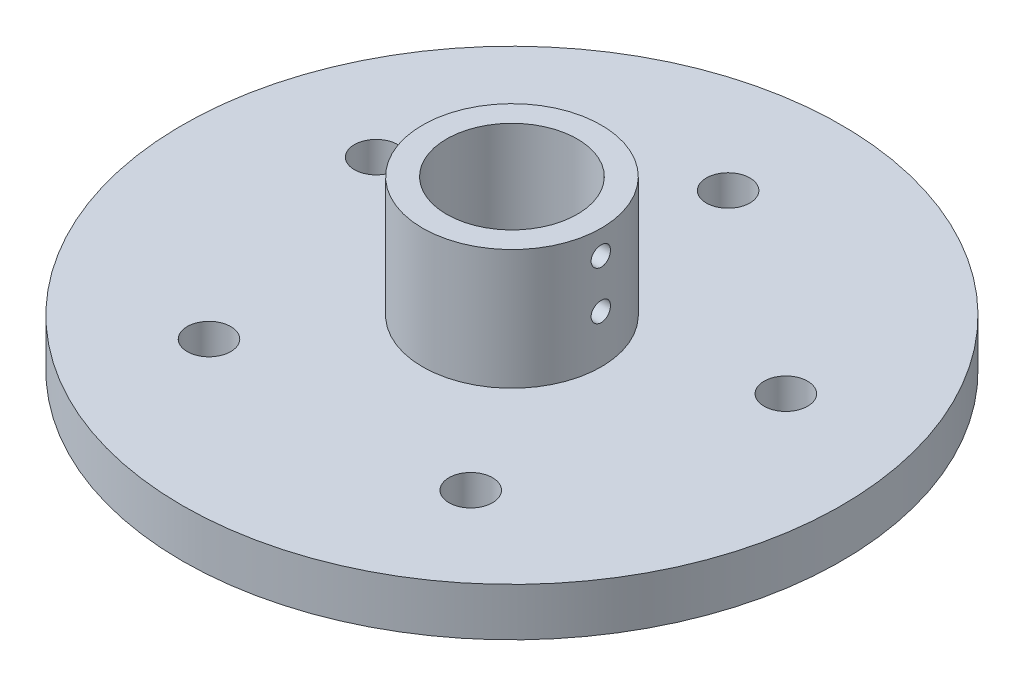
ISO-10303-21;
HEADER;
FILE_DESCRIPTION(('STEP AP214'),'2;1');
FILE_NAME('part.step','',(''),(''),'','','');
FILE_SCHEMA(('AUTOMOTIVE_DESIGN { 1 0 10303 214 1 1 1 1 }'));
ENDSEC;
DATA;
#1=APPLICATION_CONTEXT('core data for automotive mechanical design processes');
#2=APPLICATION_PROTOCOL_DEFINITION('international standard','automotive_design',2000,#1);
#3=PRODUCT_CONTEXT('',#1,'mechanical');
#4=PRODUCT('Part','Part','',(#3));
#5=PRODUCT_RELATED_PRODUCT_CATEGORY('part','',(#4));
#6=PRODUCT_DEFINITION_FORMATION('','',#4);
#7=PRODUCT_DEFINITION_CONTEXT('part definition',#1,'design');
#8=PRODUCT_DEFINITION('design','',#6,#7);
#9=PRODUCT_DEFINITION_SHAPE('','',#8);
#10=(LENGTH_UNIT() NAMED_UNIT(*) SI_UNIT(.MILLI.,.METRE.));
#11=(NAMED_UNIT(*) PLANE_ANGLE_UNIT() SI_UNIT($,.RADIAN.));
#12=(NAMED_UNIT(*) SI_UNIT($,.STERADIAN.) SOLID_ANGLE_UNIT());
#13=UNCERTAINTY_MEASURE_WITH_UNIT(LENGTH_MEASURE(1.E-05),#10,'distance_accuracy_value','');
#14=(GEOMETRIC_REPRESENTATION_CONTEXT(3) GLOBAL_UNCERTAINTY_ASSIGNED_CONTEXT((#13)) GLOBAL_UNIT_ASSIGNED_CONTEXT((#10,
#11,#12)) REPRESENTATION_CONTEXT('',''));
#15=CARTESIAN_POINT('',(0.,0.,0.));
#16=DIRECTION('',(0.,0.,1.));
#17=DIRECTION('',(1.,0.,0.));
#18=AXIS2_PLACEMENT_3D('',#15,#16,#17);
#19=CARTESIAN_POINT('',(0.,12.7,0.));
#20=DIRECTION('',(0.,1.,0.));
#21=DIRECTION('',(0.,0.,1.));
#22=AXIS2_PLACEMENT_3D('',#19,#20,#21);
#23=PLANE('',#22);
#24=CARTESIAN_POINT('',(-54.1556260783448,12.7,-18.25625));
#25=DIRECTION('',(0.,1.,0.));
#26=DIRECTION('',(0.,0.,1.));
#27=AXIS2_PLACEMENT_3D('',#24,#25,#26);
#28=CIRCLE('',#27,5.75437);
#29=CARTESIAN_POINT('',(-54.1556260783448,12.7,-12.50188));
#30=VERTEX_POINT('',#29);
#31=EDGE_CURVE('E102',#30,#30,#28,.T.);
#32=ORIENTED_EDGE('',*,*,#31,.F.);
#33=EDGE_LOOP('',(#32));
#34=FACE_BOUND('',#33,.T.);
#35=CARTESIAN_POINT('',(0.,12.7,-57.15));
#36=DIRECTION('',(0.,1.,0.));
#37=DIRECTION('',(0.,0.,1.));
#38=AXIS2_PLACEMENT_3D('',#35,#36,#37);
#39=CIRCLE('',#38,5.75437);
#40=CARTESIAN_POINT('',(0.,12.7,-51.39563));
#41=VERTEX_POINT('',#40);
#42=EDGE_CURVE('E161',#41,#41,#39,.T.);
#43=ORIENTED_EDGE('',*,*,#42,.F.);
#44=EDGE_LOOP('',(#43));
#45=FACE_BOUND('',#44,.T.);
#46=CARTESIAN_POINT('',(54.1556260783448,12.7,-18.25625));
#47=DIRECTION('',(0.,1.,0.));
#48=DIRECTION('',(0.,0.,1.));
#49=AXIS2_PLACEMENT_3D('',#46,#47,#48);
#50=CIRCLE('',#49,5.75437);
#51=CARTESIAN_POINT('',(54.1556260783448,12.7,-12.50188));
#52=VERTEX_POINT('',#51);
#53=EDGE_CURVE('E168',#52,#52,#50,.T.);
#54=ORIENTED_EDGE('',*,*,#53,.F.);
#55=EDGE_LOOP('',(#54));
#56=FACE_BOUND('',#55,.T.);
#57=CARTESIAN_POINT('',(34.5994277722758,12.7,45.4862847222222));
#58=DIRECTION('',(0.,1.,0.));
#59=DIRECTION('',(0.,0.,1.));
#60=AXIS2_PLACEMENT_3D('',#57,#58,#59);
#61=CIRCLE('',#60,5.75437);
#62=CARTESIAN_POINT('',(34.5994277722758,12.7,51.2406547222222));
#63=VERTEX_POINT('',#62);
#64=EDGE_CURVE('E185',#63,#63,#61,.T.);
#65=ORIENTED_EDGE('',*,*,#64,.F.);
#66=EDGE_LOOP('',(#65));
#67=FACE_BOUND('',#66,.T.);
#68=CARTESIAN_POINT('',(-34.5994277722758,12.7,45.4862847222222));
#69=DIRECTION('',(0.,1.,0.));
#70=DIRECTION('',(0.,0.,1.));
#71=AXIS2_PLACEMENT_3D('',#68,#69,#70);
#72=CIRCLE('',#71,5.75437);
#73=CARTESIAN_POINT('',(-34.5994277722758,12.7,51.2406547222222));
#74=VERTEX_POINT('',#73);
#75=EDGE_CURVE('E192',#74,#74,#72,.T.);
#76=ORIENTED_EDGE('',*,*,#75,.F.);
#77=EDGE_LOOP('',(#76));
#78=FACE_BOUND('',#77,.T.);
#79=CARTESIAN_POINT('',(0.,12.7,0.));
#80=DIRECTION('',(0.,1.,0.));
#81=DIRECTION('',(0.,0.,1.));
#82=AXIS2_PLACEMENT_3D('',#79,#80,#81);
#83=CIRCLE('',#82,87.122);
#84=CARTESIAN_POINT('',(0.,12.7,87.122));
#85=VERTEX_POINT('',#84);
#86=EDGE_CURVE('E73',#85,#85,#83,.T.);
#87=ORIENTED_EDGE('',*,*,#86,.T.);
#88=EDGE_LOOP('',(#87));
#89=FACE_BOUND('',#88,.T.);
#90=CARTESIAN_POINT('',(0.,12.7,0.));
#91=DIRECTION('',(0.,1.,0.));
#92=DIRECTION('',(0.,0.,1.));
#93=AXIS2_PLACEMENT_3D('',#90,#91,#92);
#94=CIRCLE('',#93,23.622);
#95=CARTESIAN_POINT('',(0.,12.7,23.622));
#96=VERTEX_POINT('',#95);
#97=EDGE_CURVE('E206',#96,#96,#94,.T.);
#98=ORIENTED_EDGE('',*,*,#97,.F.);
#99=EDGE_LOOP('',(#98));
#100=FACE_BOUND('',#99,.T.);
#101=ADVANCED_FACE('F52',(#34,#45,#56,#67,#78,#89,#100),#23,.T.);
#102=CARTESIAN_POINT('',(0.,7.80947580645162,0.));
#103=DIRECTION('',(0.,1.,0.));
#104=DIRECTION('',(0.,0.,1.));
#105=AXIS2_PLACEMENT_3D('',#102,#103,#104);
#106=CYLINDRICAL_SURFACE('',#105,87.122);
#107=ORIENTED_EDGE('',*,*,#86,.F.);
#108=EDGE_LOOP('',(#107));
#109=FACE_BOUND('',#108,.T.);
#110=CARTESIAN_POINT('',(0.,0.,0.));
#111=DIRECTION('',(0.,1.,0.));
#112=DIRECTION('',(0.,0.,1.));
#113=AXIS2_PLACEMENT_3D('',#110,#111,#112);
#114=CIRCLE('',#113,87.122);
#115=CARTESIAN_POINT('',(0.,0.,87.122));
#116=VERTEX_POINT('',#115);
#117=EDGE_CURVE('E66',#116,#116,#114,.T.);
#118=ORIENTED_EDGE('',*,*,#117,.T.);
#119=EDGE_LOOP('',(#118));
#120=FACE_BOUND('',#119,.T.);
#121=ADVANCED_FACE('F118',(#109,#120),#106,.T.);
#122=CARTESIAN_POINT('',(0.,0.,0.));
#123=DIRECTION('',(0.,1.,0.));
#124=DIRECTION('',(0.,0.,1.));
#125=AXIS2_PLACEMENT_3D('',#122,#123,#124);
#126=PLANE('',#125);
#127=CARTESIAN_POINT('',(-54.1556260783448,0.,-18.25625));
#128=DIRECTION('',(0.,1.,0.));
#129=DIRECTION('',(0.,0.,1.));
#130=AXIS2_PLACEMENT_3D('',#127,#128,#129);
#131=CIRCLE('',#130,5.75436999999999);
#132=CARTESIAN_POINT('',(-54.1556260783448,0.,-12.50188));
#133=VERTEX_POINT('',#132);
#134=EDGE_CURVE('E164',#133,#133,#131,.T.);
#135=ORIENTED_EDGE('',*,*,#134,.T.);
#136=EDGE_LOOP('',(#135));
#137=FACE_BOUND('',#136,.T.);
#138=CARTESIAN_POINT('',(0.,0.,-57.15));
#139=DIRECTION('',(0.,1.,0.));
#140=DIRECTION('',(0.,0.,1.));
#141=AXIS2_PLACEMENT_3D('',#138,#139,#140);
#142=CIRCLE('',#141,5.75437);
#143=CARTESIAN_POINT('',(0.,0.,-51.39563));
#144=VERTEX_POINT('',#143);
#145=EDGE_CURVE('E158',#144,#144,#142,.T.);
#146=ORIENTED_EDGE('',*,*,#145,.T.);
#147=EDGE_LOOP('',(#146));
#148=FACE_BOUND('',#147,.T.);
#149=CARTESIAN_POINT('',(54.1556260783448,0.,-18.25625));
#150=DIRECTION('',(0.,1.,0.));
#151=DIRECTION('',(0.,0.,1.));
#152=AXIS2_PLACEMENT_3D('',#149,#150,#151);
#153=CIRCLE('',#152,5.75436999999999);
#154=CARTESIAN_POINT('',(54.1556260783448,0.,-12.50188));
#155=VERTEX_POINT('',#154);
#156=EDGE_CURVE('E181',#155,#155,#153,.T.);
#157=ORIENTED_EDGE('',*,*,#156,.T.);
#158=EDGE_LOOP('',(#157));
#159=FACE_BOUND('',#158,.T.);
#160=CARTESIAN_POINT('',(34.5994277722758,0.,45.4862847222222));
#161=DIRECTION('',(0.,1.,0.));
#162=DIRECTION('',(0.,0.,1.));
#163=AXIS2_PLACEMENT_3D('',#160,#161,#162);
#164=CIRCLE('',#163,5.75436999999999);
#165=CARTESIAN_POINT('',(34.5994277722758,0.,51.2406547222222));
#166=VERTEX_POINT('',#165);
#167=EDGE_CURVE('E187',#166,#166,#164,.T.);
#168=ORIENTED_EDGE('',*,*,#167,.T.);
#169=EDGE_LOOP('',(#168));
#170=FACE_BOUND('',#169,.T.);
#171=CARTESIAN_POINT('',(-34.5994277722758,0.,45.4862847222222));
#172=DIRECTION('',(0.,1.,0.));
#173=DIRECTION('',(0.,0.,1.));
#174=AXIS2_PLACEMENT_3D('',#171,#172,#173);
#175=CIRCLE('',#174,5.75436999999999);
#176=CARTESIAN_POINT('',(-34.5994277722758,0.,51.2406547222222));
#177=VERTEX_POINT('',#176);
#178=EDGE_CURVE('E195',#177,#177,#175,.T.);
#179=ORIENTED_EDGE('',*,*,#178,.T.);
#180=EDGE_LOOP('',(#179));
#181=FACE_BOUND('',#180,.T.);
#182=ORIENTED_EDGE('',*,*,#117,.F.);
#183=EDGE_LOOP('',(#182));
#184=FACE_BOUND('',#183,.T.);
#185=CARTESIAN_POINT('',(0.,0.,0.));
#186=DIRECTION('',(0.,1.,0.));
#187=DIRECTION('',(0.,0.,1.));
#188=AXIS2_PLACEMENT_3D('',#185,#186,#187);
#189=CIRCLE('',#188,17.272);
#190=CARTESIAN_POINT('',(0.,0.,17.272));
#191=VERTEX_POINT('',#190);
#192=EDGE_CURVE('E11',#191,#191,#189,.T.);
#193=ORIENTED_EDGE('',*,*,#192,.T.);
#194=EDGE_LOOP('',(#193));
#195=FACE_BOUND('',#194,.T.);
#196=ADVANCED_FACE('F121',(#137,#148,#159,#170,#181,#184,#195),#126,.F.);
#197=CARTESIAN_POINT('',(0.,44.45,0.));
#198=DIRECTION('',(0.,1.,0.));
#199=DIRECTION('',(0.,0.,1.));
#200=AXIS2_PLACEMENT_3D('',#197,#198,#199);
#201=PLANE('',#200);
#202=CARTESIAN_POINT('',(0.,44.45,0.));
#203=DIRECTION('',(0.,1.,0.));
#204=DIRECTION('',(0.,0.,1.));
#205=AXIS2_PLACEMENT_3D('',#202,#203,#204);
#206=CIRCLE('',#205,23.622);
#207=CARTESIAN_POINT('',(0.,44.45,23.622));
#208=VERTEX_POINT('',#207);
#209=EDGE_CURVE('E203',#208,#208,#206,.T.);
#210=ORIENTED_EDGE('',*,*,#209,.T.);
#211=EDGE_LOOP('',(#210));
#212=FACE_BOUND('',#211,.T.);
#213=CARTESIAN_POINT('',(0.,44.45,0.));
#214=DIRECTION('',(0.,1.,0.));
#215=DIRECTION('',(0.,0.,1.));
#216=AXIS2_PLACEMENT_3D('',#213,#214,#215);
#217=CIRCLE('',#216,17.272);
#218=CARTESIAN_POINT('',(0.,44.45,17.272));
#219=VERTEX_POINT('',#218);
#220=EDGE_CURVE('E200',#219,#219,#217,.T.);
#221=ORIENTED_EDGE('',*,*,#220,.F.);
#222=EDGE_LOOP('',(#221));
#223=FACE_BOUND('',#222,.T.);
#224=ADVANCED_FACE('F112',(#212,#223),#201,.T.);
#225=CARTESIAN_POINT('',(0.,7.80947580645162,0.));
#226=DIRECTION('',(0.,1.,0.));
#227=DIRECTION('',(0.,0.,1.));
#228=AXIS2_PLACEMENT_3D('',#225,#226,#227);
#229=CYLINDRICAL_SURFACE('',#228,23.622);
#230=CARTESIAN_POINT('',(23.4836668071662,38.1,2.55269999999999));
#231=CARTESIAN_POINT('',(23.4836686081218,38.2429364135109,2.55269384011101));
#232=CARTESIAN_POINT('',(23.4849858802919,38.3859657957874,2.540654126633));
#233=CARTESIAN_POINT('',(23.4901115382062,38.6680545531481,2.49280973768584));
#234=CARTESIAN_POINT('',(23.4939226267569,38.8071094498179,2.45697927710405));
#235=CARTESIAN_POINT('',(23.5035993053341,39.077123585863,2.36261284870633));
#236=CARTESIAN_POINT('',(23.5094636052178,39.2080878483649,2.30409113654485));
#237=CARTESIAN_POINT('',(23.5225843723355,39.4583083304028,2.16603179783894));
#238=CARTESIAN_POINT('',(23.5298405745369,39.577566772322,2.08649817109179));
#239=CARTESIAN_POINT('',(23.5449618611822,39.8015208112132,1.9083124095274));
#240=CARTESIAN_POINT('',(23.5528291321937,39.9061599726728,1.80958952169591));
#241=CARTESIAN_POINT('',(23.5682663281105,40.0974186744241,1.5959792465784));
#242=CARTESIAN_POINT('',(23.5758362390508,40.184037369236,1.48109110127853));
#243=CARTESIAN_POINT('',(23.5898476712134,40.3369939918702,1.23806267414504));
#244=CARTESIAN_POINT('',(23.5962863749723,40.4032815791767,1.10989053286984));
#245=CARTESIAN_POINT('',(23.6072860476201,40.5133721721303,0.844153107984615));
#246=CARTESIAN_POINT('',(23.6118470693922,40.5571758110268,0.706588089044095));
#247=CARTESIAN_POINT('',(23.618562107544,40.6208884833524,0.426542689068769));
#248=CARTESIAN_POINT('',(23.6207255011527,40.6408906282674,0.28408372010064));
#249=CARTESIAN_POINT('',(23.6224334616832,40.6567207680119,-0.00218442497647582));
#250=CARTESIAN_POINT('',(23.6219781070125,40.6525494866137,-0.145993560531656));
#251=CARTESIAN_POINT('',(23.6185075248789,40.6202264750132,-0.430247318832561));
#252=CARTESIAN_POINT('',(23.6155029859548,40.5921748715653,-0.570703475939404));
#253=CARTESIAN_POINT('',(23.6072838389455,40.5130436421409,-0.844902575482428));
#254=CARTESIAN_POINT('',(23.6020691980714,40.4619636745171,-0.978645418287599));
#255=CARTESIAN_POINT('',(23.5899975944878,40.3381168959008,-1.23593535300113));
#256=CARTESIAN_POINT('',(23.5831373041593,40.265306069786,-1.35946109572668));
#257=CARTESIAN_POINT('',(23.5685435187522,40.1000963808536,-1.59257745149923));
#258=CARTESIAN_POINT('',(23.5608099937467,40.0076968466079,-1.70216758667929));
#259=CARTESIAN_POINT('',(23.5452902509772,39.8053701941459,-1.90488886464143));
#260=CARTESIAN_POINT('',(23.5375039658879,39.6953559251848,-1.99793304295514));
#261=CARTESIAN_POINT('',(23.5227955644744,39.4612240295925,-2.16424717070808));
#262=CARTESIAN_POINT('',(23.5158734497749,39.3371063764461,-2.23751708296947));
#263=CARTESIAN_POINT('',(23.5036767608849,39.0782209498679,-2.36220399533878));
#264=CARTESIAN_POINT('',(23.4984026276002,38.9434503383762,-2.41361514861577));
#265=CARTESIAN_POINT('',(23.4901080428948,38.6671198150243,-2.49305388469559));
#266=CARTESIAN_POINT('',(23.487087511003,38.525560145779,-2.52108230245021));
#267=CARTESIAN_POINT('',(23.48365632423,38.2404346937009,-2.55284709431941));
#268=CARTESIAN_POINT('',(23.4832325752727,38.0968826401844,-2.55670534681208));
#269=CARTESIAN_POINT('',(23.485008359159,37.8111762779908,-2.54034081393235));
#270=CARTESIAN_POINT('',(23.4872078504864,37.6690219472288,-2.52011840966661));
#271=CARTESIAN_POINT('',(23.4939703671203,37.3905044989211,-2.45626876903324));
#272=CARTESIAN_POINT('',(23.498527530066,37.2541279207474,-2.41269957499601));
#273=CARTESIAN_POINT('',(23.5094871631114,36.9906179962903,-2.30345252508868));
#274=CARTESIAN_POINT('',(23.5158896823109,36.8634848960628,-2.23777408094507));
#275=CARTESIAN_POINT('',(23.5298502314998,36.6215164665234,-2.08586927615529));
#276=CARTESIAN_POINT('',(23.5374127465008,36.5067319455461,-1.99956240184101));
#277=CARTESIAN_POINT('',(23.5528266933129,36.2932351654284,-1.80896559642935));
#278=CARTESIAN_POINT('',(23.5606781334819,36.1945233716883,-1.70467514478139));
#279=CARTESIAN_POINT('',(23.5758250170651,36.0155514713621,-1.48054176424411));
#280=CARTESIAN_POINT('',(23.5831179724798,35.9353710467982,-1.36063501701851));
#281=CARTESIAN_POINT('',(23.5962896701766,35.7962871282659,-1.10898651179103));
#282=CARTESIAN_POINT('',(23.6021684346312,35.7373833007013,-0.977244939387995));
#283=CARTESIAN_POINT('',(23.6118382016169,35.6426586335324,-0.705940580734201));
#284=CARTESIAN_POINT('',(23.6156334983186,35.6067902900693,-0.566394539543646));
#285=CARTESIAN_POINT('',(23.6207263910402,35.5589998657335,-0.283217374619929));
#286=CARTESIAN_POINT('',(23.622024069881,35.5470769908294,-0.13958638650375));
#287=CARTESIAN_POINT('',(23.6219753690865,35.5475281994281,0.146902267715191));
#288=CARTESIAN_POINT('',(23.6206424230491,35.5597788379687,0.289760146473107));
#289=CARTESIAN_POINT('',(23.6155087930972,35.6079696903967,0.571375316873879));
#290=CARTESIAN_POINT('',(23.6117081081962,35.6439099137525,0.710132606877765));
#291=CARTESIAN_POINT('',(23.6020645888925,35.7384241100541,0.979602195442227));
#292=CARTESIAN_POINT('',(23.5962221441369,35.7969937646483,1.11031602341487));
#293=CARTESIAN_POINT('',(23.5831450699929,35.9350912992218,1.36007772728759));
#294=CARTESIAN_POINT('',(23.5759104412683,36.0146191692069,1.47912560875077));
#295=CARTESIAN_POINT('',(23.5608144410359,36.192837059665,1.70280837703507));
#296=CARTESIAN_POINT('',(23.5529501723802,36.2916190589809,1.80736978712328));
#297=CARTESIAN_POINT('',(23.5375054237403,36.505355611115,1.99848461943137));
#298=CARTESIAN_POINT('',(23.5299250120099,36.6203140223652,2.08503373307506));
#299=CARTESIAN_POINT('',(23.5158825802368,36.863514918412,2.2378731774088));
#300=CARTESIAN_POINT('',(23.5094238964196,36.9917952763929,2.30410350934285));
#301=CARTESIAN_POINT('',(23.4983956660834,37.2576475852266,2.41399314979676));
#302=CARTESIAN_POINT('',(23.4938240125341,37.3952089721659,2.45767764639081));
#303=CARTESIAN_POINT('',(23.4882276739176,37.6279417722447,2.51047093297569));
#304=CARTESIAN_POINT('',(23.4865255636348,37.7216307775616,2.52628485855407));
#305=CARTESIAN_POINT('',(23.4842445351498,37.9101995263131,2.54740141046238));
#306=CARTESIAN_POINT('',(23.4836656111937,38.0050792636454,2.55270409063851));
#307=CARTESIAN_POINT('',(23.4836668071662,38.1,2.55269999999999));
#308=B_SPLINE_CURVE_WITH_KNOTS('',3,(#230,#231,#232,#233,#234,#235,#236,#237,#238,#239,#240,
#241,#242,#243,#244,#245,#246,#247,#248,#249,#250,#251,#252,#253,#254,#255,#256,#257,#258,#259,
#260,#261,#262,#263,#264,#265,#266,#267,#268,#269,#270,#271,#272,#273,#274,#275,#276,#277,#278,
#279,#280,#281,#282,#283,#284,#285,#286,#287,#288,#289,#290,#291,#292,#293,#294,#295,#296,#297,
#298,#299,#300,#301,#302,#303,#304,#305,#306,#307),.UNSPECIFIED.,.T.,.F.,(4,2,2,2,2,2,2,2,2,2,2,
2,2,2,2,2,2,2,2,2,2,2,2,2,2,2,2,2,2,2,2,2,2,2,2,2,2,2,4),(0.,0.428462570461049,0.85739028095419,
1.28604895544343,1.71462608981717,2.14481448535293,2.57502305981274,3.00628840258511,
3.43754159831156,3.86710212557845,4.29664979151724,4.72440524653955,5.15216704792278,
5.58080121523754,6.00945007691676,6.44028927060365,6.8711292743108,7.30208444769941,
7.73302423186206,8.1617892356114,8.59054745370565,9.01824465033163,9.44595322784211,
9.87535924438522,10.3047776925535,10.7360095781225,11.167234702107,11.597567672102,
12.0278863720242,12.4560132840799,12.8841403672518,13.3121857916799,13.7402310119863,
14.1703735087934,14.6006187785587,15.0321225433802,15.4631431854951,15.7476766366445,
16.0322086302044),.UNSPECIFIED.);
#309=CARTESIAN_POINT('',(23.4836668071662,38.1,2.55269999999999));
#310=VERTEX_POINT('',#309);
#311=EDGE_CURVE('E83',#310,#310,#308,.T.);
#312=ORIENTED_EDGE('',*,*,#311,.T.);
#313=EDGE_LOOP('',(#312));
#314=FACE_BOUND('',#313,.T.);
#315=CARTESIAN_POINT('',(23.4836668071662,25.4,2.5527));
#316=CARTESIAN_POINT('',(23.4836686081218,25.5429364135109,2.55269384011101));
#317=CARTESIAN_POINT('',(23.4849858802919,25.6859657957874,2.540654126633));
#318=CARTESIAN_POINT('',(23.4901115382062,25.9680545531481,2.49280973768584));
#319=CARTESIAN_POINT('',(23.4939226267569,26.1071094498179,2.45697927710405));
#320=CARTESIAN_POINT('',(23.5035993053341,26.377123585863,2.36261284870633));
#321=CARTESIAN_POINT('',(23.5094636052178,26.5080878483649,2.30409113654485));
#322=CARTESIAN_POINT('',(23.5225843723355,26.7583083304028,2.16603179783895));
#323=CARTESIAN_POINT('',(23.5298405745369,26.8775667723219,2.0864981710918));
#324=CARTESIAN_POINT('',(23.5449618611822,27.1015208112132,1.9083124095274));
#325=CARTESIAN_POINT('',(23.5528291321937,27.2061599726728,1.80958952169591));
#326=CARTESIAN_POINT('',(23.5682663281105,27.3974186744241,1.5959792465784));
#327=CARTESIAN_POINT('',(23.5758362390508,27.484037369236,1.48109110127853));
#328=CARTESIAN_POINT('',(23.5898476712134,27.6369939918702,1.23806267414504));
#329=CARTESIAN_POINT('',(23.5962863749723,27.7032815791767,1.10989053286984));
#330=CARTESIAN_POINT('',(23.6072860476201,27.8133721721303,0.844153107984615));
#331=CARTESIAN_POINT('',(23.6118470693922,27.8571758110268,0.706588089044096));
#332=CARTESIAN_POINT('',(23.618562107544,27.9208884833524,0.426542689068772));
#333=CARTESIAN_POINT('',(23.6207255011527,27.9408906282674,0.284083720100642));
#334=CARTESIAN_POINT('',(23.6224334616832,27.9567207680119,-0.00218442497647395));
#335=CARTESIAN_POINT('',(23.6219781070125,27.9525494866137,-0.145993560531653));
#336=CARTESIAN_POINT('',(23.6185075248789,27.9202264750132,-0.430247318832559));
#337=CARTESIAN_POINT('',(23.6155029859548,27.8921748715653,-0.570703475939403));
#338=CARTESIAN_POINT('',(23.6072838389455,27.8130436421409,-0.844902575482428));
#339=CARTESIAN_POINT('',(23.6020691980714,27.7619636745171,-0.978645418287598));
#340=CARTESIAN_POINT('',(23.5899975944878,27.6381168959008,-1.23593535300113));
#341=CARTESIAN_POINT('',(23.5831373041593,27.565306069786,-1.35946109572668));
#342=CARTESIAN_POINT('',(23.5685435187522,27.4000963808536,-1.59257745149923));
#343=CARTESIAN_POINT('',(23.5608099937467,27.3076968466079,-1.70216758667929));
#344=CARTESIAN_POINT('',(23.5452902509772,27.1053701941459,-1.90488886464143));
#345=CARTESIAN_POINT('',(23.5375039658879,26.9953559251848,-1.99793304295515));
#346=CARTESIAN_POINT('',(23.5227955644744,26.7612240295925,-2.16424717070808));
#347=CARTESIAN_POINT('',(23.5158734497749,26.6371063764461,-2.23751708296947));
#348=CARTESIAN_POINT('',(23.5036767608849,26.3782209498679,-2.36220399533878));
#349=CARTESIAN_POINT('',(23.4984026276002,26.2434503383762,-2.41361514861577));
#350=CARTESIAN_POINT('',(23.4901080428948,25.9671198150243,-2.49305388469559));
#351=CARTESIAN_POINT('',(23.487087511003,25.825560145779,-2.52108230245021));
#352=CARTESIAN_POINT('',(23.48365632423,25.5404346937009,-2.55284709431941));
#353=CARTESIAN_POINT('',(23.4832325752727,25.3968826401844,-2.55670534681208));
#354=CARTESIAN_POINT('',(23.485008359159,25.1111762779908,-2.54034081393235));
#355=CARTESIAN_POINT('',(23.4872078504864,24.9690219472288,-2.52011840966662));
#356=CARTESIAN_POINT('',(23.4939703671203,24.6905044989211,-2.45626876903324));
#357=CARTESIAN_POINT('',(23.498527530066,24.5541279207474,-2.41269957499601));
#358=CARTESIAN_POINT('',(23.5094871631114,24.2906179962903,-2.30345252508868));
#359=CARTESIAN_POINT('',(23.5158896823109,24.1634848960628,-2.23777408094507));
#360=CARTESIAN_POINT('',(23.5298502314998,23.9215164665234,-2.08586927615529));
#361=CARTESIAN_POINT('',(23.5374127465008,23.8067319455461,-1.99956240184101));
#362=CARTESIAN_POINT('',(23.5528266933129,23.5932351654284,-1.80896559642935));
#363=CARTESIAN_POINT('',(23.5606781334819,23.4945233716882,-1.70467514478139));
#364=CARTESIAN_POINT('',(23.5758250170651,23.315551471362,-1.48054176424411));
#365=CARTESIAN_POINT('',(23.5831179724798,23.2353710467982,-1.3606350170185));
#366=CARTESIAN_POINT('',(23.5962896701766,23.0962871282659,-1.10898651179103));
#367=CARTESIAN_POINT('',(23.6021684346312,23.0373833007013,-0.977244939387993));
#368=CARTESIAN_POINT('',(23.6118382016169,22.9426586335324,-0.705940580734201));
#369=CARTESIAN_POINT('',(23.6156334983186,22.9067902900693,-0.566394539543646));
#370=CARTESIAN_POINT('',(23.6207263910402,22.8589998657335,-0.28321737461993));
#371=CARTESIAN_POINT('',(23.622024069881,22.8470769908294,-0.139586386503751));
#372=CARTESIAN_POINT('',(23.6219753690865,22.8475281994281,0.146902267715189));
#373=CARTESIAN_POINT('',(23.6206424230491,22.8597788379687,0.289760146473105));
#374=CARTESIAN_POINT('',(23.6155087930972,22.9079696903967,0.571375316873878));
#375=CARTESIAN_POINT('',(23.6117081081962,22.9439099137525,0.710132606877764));
#376=CARTESIAN_POINT('',(23.6020645888925,23.0384241100541,0.979602195442227));
#377=CARTESIAN_POINT('',(23.5962221441369,23.0969937646483,1.11031602341488));
#378=CARTESIAN_POINT('',(23.5831450699929,23.2350912992218,1.36007772728759));
#379=CARTESIAN_POINT('',(23.5759104412683,23.3146191692068,1.47912560875077));
#380=CARTESIAN_POINT('',(23.5608144410359,23.492837059665,1.70280837703507));
#381=CARTESIAN_POINT('',(23.5529501723802,23.5916190589809,1.80736978712328));
#382=CARTESIAN_POINT('',(23.5375054237403,23.805355611115,1.99848461943137));
#383=CARTESIAN_POINT('',(23.5299250120099,23.9203140223652,2.08503373307506));
#384=CARTESIAN_POINT('',(23.5158825802368,24.163514918412,2.2378731774088));
#385=CARTESIAN_POINT('',(23.5094238964196,24.2917952763929,2.30410350934285));
#386=CARTESIAN_POINT('',(23.4983956660834,24.5576475852266,2.41399314979676));
#387=CARTESIAN_POINT('',(23.4938240125341,24.6952089721659,2.45767764639081));
#388=CARTESIAN_POINT('',(23.4882276739176,24.9279417722447,2.51047093297569));
#389=CARTESIAN_POINT('',(23.4865255636348,25.0216307775616,2.52628485855407));
#390=CARTESIAN_POINT('',(23.4842445351498,25.2101995263131,2.54740141046239));
#391=CARTESIAN_POINT('',(23.4836656111937,25.3050792636454,2.55270409063851));
#392=CARTESIAN_POINT('',(23.4836668071662,25.4,2.5527));
#393=B_SPLINE_CURVE_WITH_KNOTS('',3,(#315,#316,#317,#318,#319,#320,#321,#322,#323,#324,#325,
#326,#327,#328,#329,#330,#331,#332,#333,#334,#335,#336,#337,#338,#339,#340,#341,#342,#343,#344,
#345,#346,#347,#348,#349,#350,#351,#352,#353,#354,#355,#356,#357,#358,#359,#360,#361,#362,#363,
#364,#365,#366,#367,#368,#369,#370,#371,#372,#373,#374,#375,#376,#377,#378,#379,#380,#381,#382,
#383,#384,#385,#386,#387,#388,#389,#390,#391,#392),.UNSPECIFIED.,.T.,.F.,(4,2,2,2,2,2,2,2,2,2,2,
2,2,2,2,2,2,2,2,2,2,2,2,2,2,2,2,2,2,2,2,2,2,2,2,2,2,2,4),(0.,0.428462570461052,0.85739028095419,
1.28604895544343,1.71462608981717,2.14481448535293,2.57502305981274,3.00628840258511,
3.43754159831156,3.86710212557845,4.29664979151724,4.72440524653955,5.15216704792278,
5.58080121523754,6.00945007691676,6.44028927060365,6.87112927431079,7.30208444769942,
7.73302423186207,8.16178923561141,8.59054745370565,9.01824465033163,9.44595322784212,
9.87535924438522,10.3047776925535,10.7360095781225,11.167234702107,11.597567672102,
12.0278863720242,12.4560132840798,12.8841403672519,13.3121857916799,13.7402310119863,
14.1703735087933,14.6006187785587,15.0321225433802,15.4631431854951,15.7476766366445,
16.0322086302044),.UNSPECIFIED.);
#394=CARTESIAN_POINT('',(23.4836668071662,25.4,2.5527));
#395=VERTEX_POINT('',#394);
#396=EDGE_CURVE('E82',#395,#395,#393,.T.);
#397=ORIENTED_EDGE('',*,*,#396,.T.);
#398=EDGE_LOOP('',(#397));
#399=FACE_BOUND('',#398,.T.);
#400=ORIENTED_EDGE('',*,*,#209,.F.);
#401=EDGE_LOOP('',(#400));
#402=FACE_BOUND('',#401,.T.);
#403=ORIENTED_EDGE('',*,*,#97,.T.);
#404=EDGE_LOOP('',(#403));
#405=FACE_BOUND('',#404,.T.);
#406=ADVANCED_FACE('F107',(#314,#399,#402,#405),#229,.T.);
#407=CARTESIAN_POINT('',(0.,7.80947580645162,0.));
#408=DIRECTION('',(0.,1.,0.));
#409=DIRECTION('',(0.,0.,1.));
#410=AXIS2_PLACEMENT_3D('',#407,#408,#409);
#411=CYLINDRICAL_SURFACE('',#410,17.272);
#412=CARTESIAN_POINT('',(17.0823214672362,38.1,2.55269999999999));
#413=CARTESIAN_POINT('',(17.0823238225018,38.2425436313864,2.55269409441162));
#414=CARTESIAN_POINT('',(17.0841249544577,38.3851706140852,2.54072010711328));
#415=CARTESIAN_POINT('',(17.0911302026157,38.6664386355629,2.49315224970954));
#416=CARTESIAN_POINT('',(17.0963376605618,38.8050756204097,2.45753518427624));
#417=CARTESIAN_POINT('',(17.1095531564361,39.0742515496556,2.36376852290549));
#418=CARTESIAN_POINT('',(17.1175590683816,39.2047965531383,2.3056360283069));
#419=CARTESIAN_POINT('',(17.1354668813449,39.4542601486703,2.16852861957197));
#420=CARTESIAN_POINT('',(17.1453685153055,39.5731803747837,2.08955664057701));
#421=CARTESIAN_POINT('',(17.1660382027981,39.7969623708413,1.91235603854233));
#422=CARTESIAN_POINT('',(17.1768118018275,39.9017206439047,1.81399734266776));
#423=CARTESIAN_POINT('',(17.1979619776925,40.0933084129066,1.60109615796998));
#424=CARTESIAN_POINT('',(17.208338532878,40.1801369323024,1.48655278822159));
#425=CARTESIAN_POINT('',(17.227583378329,40.3337813972506,1.24387176330826));
#426=CARTESIAN_POINT('',(17.2364444131894,40.4005021784704,1.11567323399565));
#427=CARTESIAN_POINT('',(17.2515984401658,40.51142662072,0.849736685498277));
#428=CARTESIAN_POINT('',(17.2578915640916,40.5556314375128,0.711999156370563));
#429=CARTESIAN_POINT('',(17.2671615880134,40.6199557878277,0.431959771540389));
#430=CARTESIAN_POINT('',(17.2701623262706,40.6402485351645,0.289698504479453));
#431=CARTESIAN_POINT('',(17.2725911507048,40.6567104533454,0.0037605721885887));
#432=CARTESIAN_POINT('',(17.2720194299631,40.6528809279294,-0.139916016128217));
#433=CARTESIAN_POINT('',(17.267386823439,40.6213439022553,-0.423424683697245));
#434=CARTESIAN_POINT('',(17.2633531679995,40.593822746821,-0.563277999699026));
#435=CARTESIAN_POINT('',(17.2522802651279,40.5159760725888,-0.836359350833755));
#436=CARTESIAN_POINT('',(17.2452409421831,40.4656499808513,-0.969587219419037));
#437=CARTESIAN_POINT('',(17.2289008185989,40.3434305375861,-1.22620107060972));
#438=CARTESIAN_POINT('',(17.2195917941794,40.2714585300899,-1.34954904617221));
#439=CARTESIAN_POINT('',(17.1997501377969,40.108047682477,-1.58248727343006));
#440=CARTESIAN_POINT('',(17.1892174276269,40.0166075978259,-1.69207664486774));
#441=CARTESIAN_POINT('',(17.1679847192624,39.8158176210127,-1.89548492328221));
#442=CARTESIAN_POINT('',(17.1572840840123,39.7063050604722,-1.98914326144839));
#443=CARTESIAN_POINT('',(17.1370197639584,39.4730320404379,-2.15677757705561));
#444=CARTESIAN_POINT('',(17.1274560857743,39.3492714979954,-2.23075343990107));
#445=CARTESIAN_POINT('',(17.1105487298975,39.0908505731954,-2.3569433978065));
#446=CARTESIAN_POINT('',(17.1032067015343,38.9561821865299,-2.40914133600008));
#447=CARTESIAN_POINT('',(17.0916033869591,38.6798575451079,-2.49013402364265));
#448=CARTESIAN_POINT('',(17.0873418902799,38.5382017684486,-2.51893037194519));
#449=CARTESIAN_POINT('',(17.0824219322369,38.2533510401467,-2.55208296424772));
#450=CARTESIAN_POINT('',(17.0817299394845,38.1101831204731,-2.55666666808156));
#451=CARTESIAN_POINT('',(17.083938348662,37.8251233060888,-2.54186708901397));
#452=CARTESIAN_POINT('',(17.0868386424892,37.6832313731092,-2.52248452733005));
#453=CARTESIAN_POINT('',(17.0958740522817,37.405453802609,-2.46049540211822));
#454=CARTESIAN_POINT('',(17.1019934214574,37.2695423868531,-2.41800185687958));
#455=CARTESIAN_POINT('',(17.1167645192017,37.0067715322961,-2.31111444773598));
#456=CARTESIAN_POINT('',(17.1254163694637,36.8799125288552,-2.24671953137968));
#457=CARTESIAN_POINT('',(17.1443567093915,36.6378270208884,-2.09730960232771));
#458=CARTESIAN_POINT('',(17.1546567107754,36.5226924199329,-2.01214716475449));
#459=CARTESIAN_POINT('',(17.1756979950476,36.3082680464856,-1.82382491301067));
#460=CARTESIAN_POINT('',(17.1864393021124,36.2089791435462,-1.7206641118073));
#461=CARTESIAN_POINT('',(17.2072575525727,36.0282494310739,-1.49827252706419));
#462=CARTESIAN_POINT('',(17.2173284298212,35.9469592426949,-1.37891868760255));
#463=CARTESIAN_POINT('',(17.2355771893485,35.8055831964284,-1.12811749169328));
#464=CARTESIAN_POINT('',(17.2437551221739,35.7454967723222,-0.996670458296676));
#465=CARTESIAN_POINT('',(17.2572699513999,35.6484753238262,-0.725887298648386));
#466=CARTESIAN_POINT('',(17.2626169980291,35.6114575005243,-0.586581367158084));
#467=CARTESIAN_POINT('',(17.269910153186,35.561355949634,-0.303645881056423));
#468=CARTESIAN_POINT('',(17.2718564794901,35.5482706894411,-0.160016603904247));
#469=CARTESIAN_POINT('',(17.2721268241917,35.5464422779497,0.126026684952052));
#470=CARTESIAN_POINT('',(17.2704851621953,35.5574684975346,0.268439243873539));
#471=CARTESIAN_POINT('',(17.2638330945784,35.6030562699311,0.549361795914624));
#472=CARTESIAN_POINT('',(17.2588226988266,35.6376177537955,0.687871800465601));
#473=CARTESIAN_POINT('',(17.2459935134527,35.7292140281585,0.956997234773108));
#474=CARTESIAN_POINT('',(17.2381766621623,35.7862333103834,1.08761804079192));
#475=CARTESIAN_POINT('',(17.2205938018145,35.9211021083077,1.33747455950076));
#476=CARTESIAN_POINT('',(17.2108277332058,35.9989522604433,1.45670992418552));
#477=CARTESIAN_POINT('',(17.1903214335313,36.1741087782183,1.6815815583943));
#478=CARTESIAN_POINT('',(17.1795731539375,36.2715855759926,1.78708435316601));
#479=CARTESIAN_POINT('',(17.1583738403051,36.4828699203881,1.98031955851257));
#480=CARTESIAN_POINT('',(17.1479228766641,36.5966812967317,2.06804779008826));
#481=CARTESIAN_POINT('',(17.1284405114435,36.8381314489941,2.22367089599095));
#482=CARTESIAN_POINT('',(17.1194171485009,36.9658421348375,2.29145518660052));
#483=CARTESIAN_POINT('',(17.1039058588231,37.2309077669307,2.40451098361134));
#484=CARTESIAN_POINT('',(17.0974152902804,37.3682524870744,2.44980596078887));
#485=CARTESIAN_POINT('',(17.0892113728737,37.605186173648,2.50626352361586));
#486=CARTESIAN_POINT('',(17.0866412767226,37.7033085508261,2.52365071348472));
#487=CARTESIAN_POINT('',(17.083195511956,37.9009404122215,2.54687094231931));
#488=CARTESIAN_POINT('',(17.0823198223576,38.0004498792463,2.5527041243655));
#489=CARTESIAN_POINT('',(17.0823214672362,38.1,2.55269999999999));
#490=B_SPLINE_CURVE_WITH_KNOTS('',3,(#412,#413,#414,#415,#416,#417,#418,#419,#420,#421,#422,
#423,#424,#425,#426,#427,#428,#429,#430,#431,#432,#433,#434,#435,#436,#437,#438,#439,#440,#441,
#442,#443,#444,#445,#446,#447,#448,#449,#450,#451,#452,#453,#454,#455,#456,#457,#458,#459,#460,
#461,#462,#463,#464,#465,#466,#467,#468,#469,#470,#471,#472,#473,#474,#475,#476,#477,#478,#479,
#480,#481,#482,#483,#484,#485,#486,#487,#488,#489),.UNSPECIFIED.,.T.,.F.,(4,2,2,2,2,2,2,2,2,2,2,
2,2,2,2,2,2,2,2,2,2,2,2,2,2,2,2,2,2,2,2,2,2,2,2,2,2,2,4),(0.,0.427267046399724,
0.854953889039228,1.28231652201789,1.7096189951175,2.13989248411483,2.57018940174993,
3.00249192057423,3.43477224671897,3.86390159368213,4.29300774762922,4.71876931810769,
5.14454158579428,5.57188009260087,5.9992459260547,6.43069229100393,6.8621411678712,
7.29390956643133,7.72564846304314,8.15332418511746,8.5809870374476,9.00657707753144,
9.43218757186493,9.86091215521316,10.289660257272,10.721871020542,11.1540702413191,
11.5847091199574,12.0153204201796,12.441830903836,12.8683401380259,13.2945553604239,
13.7207836062693,14.1508864503075,14.5810902993035,15.0136364037664,15.4457301313648,
15.7441300836478,16.0425263406358),.UNSPECIFIED.);
#491=CARTESIAN_POINT('',(17.0823214672362,38.1,2.55269999999999));
#492=VERTEX_POINT('',#491);
#493=EDGE_CURVE('E57',#492,#492,#490,.T.);
#494=ORIENTED_EDGE('',*,*,#493,.F.);
#495=EDGE_LOOP('',(#494));
#496=FACE_BOUND('',#495,.T.);
#497=CARTESIAN_POINT('',(17.0823214672362,25.4,2.5527));
#498=CARTESIAN_POINT('',(17.0823238225018,25.5425436313864,2.55269409441162));
#499=CARTESIAN_POINT('',(17.0841249544577,25.6851706140851,2.54072010711328));
#500=CARTESIAN_POINT('',(17.0911302026157,25.9664386355629,2.49315224970954));
#501=CARTESIAN_POINT('',(17.0963376605618,26.1050756204097,2.45753518427624));
#502=CARTESIAN_POINT('',(17.1095531564361,26.3742515496556,2.36376852290549));
#503=CARTESIAN_POINT('',(17.1175590683816,26.5047965531383,2.30563602830691));
#504=CARTESIAN_POINT('',(17.1354668813449,26.7542601486703,2.16852861957198));
#505=CARTESIAN_POINT('',(17.1453685153055,26.8731803747836,2.08955664057701));
#506=CARTESIAN_POINT('',(17.1660382027981,27.0969623708413,1.91235603854234));
#507=CARTESIAN_POINT('',(17.1768118018275,27.2017206439047,1.81399734266777));
#508=CARTESIAN_POINT('',(17.1979619776925,27.3933084129066,1.60109615796998));
#509=CARTESIAN_POINT('',(17.208338532878,27.4801369323024,1.48655278822159));
#510=CARTESIAN_POINT('',(17.227583378329,27.6337813972506,1.24387176330827));
#511=CARTESIAN_POINT('',(17.2364444131894,27.7005021784704,1.11567323399566));
#512=CARTESIAN_POINT('',(17.2515984401658,27.81142662072,0.849736685498285));
#513=CARTESIAN_POINT('',(17.2578915640916,27.8556314375128,0.71199915637057));
#514=CARTESIAN_POINT('',(17.2671615880134,27.9199557878277,0.431959771540396));
#515=CARTESIAN_POINT('',(17.2701623262706,27.9402485351645,0.289698504479459));
#516=CARTESIAN_POINT('',(17.2725911507048,27.9567104533454,0.00376057218859504));
#517=CARTESIAN_POINT('',(17.2720194299631,27.9528809279294,-0.139916016128211));
#518=CARTESIAN_POINT('',(17.267386823439,27.9213439022553,-0.42342468369724));
#519=CARTESIAN_POINT('',(17.2633531679995,27.893822746821,-0.563277999699021));
#520=CARTESIAN_POINT('',(17.2522802651279,27.8159760725888,-0.83635935083375));
#521=CARTESIAN_POINT('',(17.2452409421831,27.7656499808513,-0.969587219419032));
#522=CARTESIAN_POINT('',(17.2289008185989,27.6434305375861,-1.22620107060972));
#523=CARTESIAN_POINT('',(17.2195917941794,27.5714585300899,-1.3495490461722));
#524=CARTESIAN_POINT('',(17.1997501377969,27.408047682477,-1.58248727343006));
#525=CARTESIAN_POINT('',(17.1892174276269,27.3166075978259,-1.69207664486773));
#526=CARTESIAN_POINT('',(17.1679847192624,27.1158176210128,-1.8954849232822));
#527=CARTESIAN_POINT('',(17.1572840840123,27.0063050604722,-1.98914326144838));
#528=CARTESIAN_POINT('',(17.1370197639584,26.7730320404379,-2.15677757705561));
#529=CARTESIAN_POINT('',(17.1274560857743,26.6492714979954,-2.23075343990107));
#530=CARTESIAN_POINT('',(17.1105487298975,26.3908505731954,-2.3569433978065));
#531=CARTESIAN_POINT('',(17.1032067015343,26.2561821865299,-2.40914133600008));
#532=CARTESIAN_POINT('',(17.0916033869591,25.9798575451079,-2.49013402364265));
#533=CARTESIAN_POINT('',(17.0873418902799,25.8382017684486,-2.51893037194519));
#534=CARTESIAN_POINT('',(17.0824219322369,25.5533510401467,-2.55208296424772));
#535=CARTESIAN_POINT('',(17.0817299394845,25.4101831204731,-2.55666666808156));
#536=CARTESIAN_POINT('',(17.083938348662,25.1251233060888,-2.54186708901398));
#537=CARTESIAN_POINT('',(17.0868386424892,24.9832313731092,-2.52248452733006));
#538=CARTESIAN_POINT('',(17.0958740522817,24.705453802609,-2.46049540211822));
#539=CARTESIAN_POINT('',(17.1019934214574,24.5695423868532,-2.41800185687958));
#540=CARTESIAN_POINT('',(17.1167645192017,24.3067715322961,-2.31111444773599));
#541=CARTESIAN_POINT('',(17.1254163694637,24.1799125288552,-2.24671953137968));
#542=CARTESIAN_POINT('',(17.1443567093915,23.9378270208884,-2.09730960232771));
#543=CARTESIAN_POINT('',(17.1546567107754,23.8226924199329,-2.01214716475449));
#544=CARTESIAN_POINT('',(17.1756979950476,23.6082680464856,-1.82382491301068));
#545=CARTESIAN_POINT('',(17.1864393021124,23.5089791435462,-1.7206641118073));
#546=CARTESIAN_POINT('',(17.2072575525727,23.3282494310739,-1.4982725270642));
#547=CARTESIAN_POINT('',(17.2173284298212,23.2469592426949,-1.37891868760255));
#548=CARTESIAN_POINT('',(17.2355771893485,23.1055831964284,-1.12811749169329));
#549=CARTESIAN_POINT('',(17.2437551221739,23.0454967723222,-0.996670458296687));
#550=CARTESIAN_POINT('',(17.2572699513999,22.9484753238262,-0.725887298648397));
#551=CARTESIAN_POINT('',(17.2626169980291,22.9114575005243,-0.586581367158095));
#552=CARTESIAN_POINT('',(17.269910153186,22.861355949634,-0.303645881056432));
#553=CARTESIAN_POINT('',(17.2718564794901,22.8482706894411,-0.160016603904255));
#554=CARTESIAN_POINT('',(17.2721268241917,22.8464422779497,0.126026684952046));
#555=CARTESIAN_POINT('',(17.2704851621953,22.8574684975346,0.268439243873535));
#556=CARTESIAN_POINT('',(17.2638330945784,22.9030562699311,0.549361795914619));
#557=CARTESIAN_POINT('',(17.2588226988266,22.9376177537955,0.687871800465596));
#558=CARTESIAN_POINT('',(17.2459935134527,23.0292140281585,0.956997234773103));
#559=CARTESIAN_POINT('',(17.2381766621623,23.0862333103833,1.08761804079192));
#560=CARTESIAN_POINT('',(17.2205938018145,23.2211021083077,1.33747455950076));
#561=CARTESIAN_POINT('',(17.2108277332058,23.2989522604433,1.45670992418552));
#562=CARTESIAN_POINT('',(17.1903214335313,23.4741087782183,1.6815815583943));
#563=CARTESIAN_POINT('',(17.1795731539375,23.5715855759926,1.78708435316601));
#564=CARTESIAN_POINT('',(17.1583738403051,23.7828699203881,1.98031955851256));
#565=CARTESIAN_POINT('',(17.1479228766641,23.8966812967317,2.06804779008825));
#566=CARTESIAN_POINT('',(17.1284405114435,24.1381314489941,2.22367089599095));
#567=CARTESIAN_POINT('',(17.1194171485009,24.2658421348375,2.29145518660052));
#568=CARTESIAN_POINT('',(17.1039058588231,24.5309077669307,2.40451098361134));
#569=CARTESIAN_POINT('',(17.0974152902804,24.6682524870744,2.44980596078886));
#570=CARTESIAN_POINT('',(17.0892113728737,24.905186173648,2.50626352361586));
#571=CARTESIAN_POINT('',(17.0866412767226,25.003308550826,2.52365071348472));
#572=CARTESIAN_POINT('',(17.083195511956,25.2009404122214,2.54687094231931));
#573=CARTESIAN_POINT('',(17.0823198223576,25.3004498792463,2.5527041243655));
#574=CARTESIAN_POINT('',(17.0823214672362,25.4,2.5527));
#575=B_SPLINE_CURVE_WITH_KNOTS('',3,(#497,#498,#499,#500,#501,#502,#503,#504,#505,#506,#507,
#508,#509,#510,#511,#512,#513,#514,#515,#516,#517,#518,#519,#520,#521,#522,#523,#524,#525,#526,
#527,#528,#529,#530,#531,#532,#533,#534,#535,#536,#537,#538,#539,#540,#541,#542,#543,#544,#545,
#546,#547,#548,#549,#550,#551,#552,#553,#554,#555,#556,#557,#558,#559,#560,#561,#562,#563,#564,
#565,#566,#567,#568,#569,#570,#571,#572,#573,#574),.UNSPECIFIED.,.T.,.F.,(4,2,2,2,2,2,2,2,2,2,2,
2,2,2,2,2,2,2,2,2,2,2,2,2,2,2,2,2,2,2,2,2,2,2,2,2,2,2,4),(0.,0.42726704639972,0.854953889039225,
1.28231652201788,1.7096189951175,2.13989248411482,2.57018940174992,3.00249192057422,
3.43477224671896,3.86390159368212,4.29300774762922,4.71876931810769,5.14454158579428,
5.57188009260086,5.99924592605469,6.43069229100392,6.8621411678712,7.29390956643133,
7.72564846304314,8.15332418511746,8.58098703744759,9.00657707753144,9.43218757186493,
9.86091215521316,10.289660257272,10.721871020542,11.1540702413191,11.5847091199574,
12.0153204201796,12.441830903836,12.8683401380259,13.2945553604239,13.7207836062693,
14.1508864503075,14.5810902993035,15.0136364037664,15.4457301313648,15.7441300836479,
16.0425263406358),.UNSPECIFIED.);
#576=CARTESIAN_POINT('',(17.0823214672362,25.4,2.5527));
#577=VERTEX_POINT('',#576);
#578=EDGE_CURVE('E76',#577,#577,#575,.T.);
#579=ORIENTED_EDGE('',*,*,#578,.F.);
#580=EDGE_LOOP('',(#579));
#581=FACE_BOUND('',#580,.T.);
#582=ORIENTED_EDGE('',*,*,#220,.T.);
#583=EDGE_LOOP('',(#582));
#584=FACE_BOUND('',#583,.T.);
#585=ORIENTED_EDGE('',*,*,#192,.F.);
#586=EDGE_LOOP('',(#585));
#587=FACE_BOUND('',#586,.T.);
#588=ADVANCED_FACE('F54',(#496,#581,#584,#587),#411,.F.);
#589=CARTESIAN_POINT('',(-34.5994277722758,12.7,45.4862847222222));
#590=DIRECTION('',(0.,1.,0.));
#591=DIRECTION('',(0.,0.,1.));
#592=AXIS2_PLACEMENT_3D('',#589,#590,#591);
#593=CYLINDRICAL_SURFACE('',#592,5.75437);
#594=ORIENTED_EDGE('',*,*,#178,.F.);
#595=EDGE_LOOP('',(#594));
#596=FACE_BOUND('',#595,.T.);
#597=ORIENTED_EDGE('',*,*,#75,.T.);
#598=EDGE_LOOP('',(#597));
#599=FACE_BOUND('',#598,.T.);
#600=ADVANCED_FACE('F125',(#596,#599),#593,.F.);
#601=CARTESIAN_POINT('',(34.5994277722758,12.7,45.4862847222222));
#602=DIRECTION('',(0.,1.,0.));
#603=DIRECTION('',(0.,0.,1.));
#604=AXIS2_PLACEMENT_3D('',#601,#602,#603);
#605=CYLINDRICAL_SURFACE('',#604,5.75437);
#606=ORIENTED_EDGE('',*,*,#167,.F.);
#607=EDGE_LOOP('',(#606));
#608=FACE_BOUND('',#607,.T.);
#609=ORIENTED_EDGE('',*,*,#64,.T.);
#610=EDGE_LOOP('',(#609));
#611=FACE_BOUND('',#610,.T.);
#612=ADVANCED_FACE('F133',(#608,#611),#605,.F.);
#613=CARTESIAN_POINT('',(54.1556260783448,12.7,-18.25625));
#614=DIRECTION('',(0.,1.,0.));
#615=DIRECTION('',(0.,0.,1.));
#616=AXIS2_PLACEMENT_3D('',#613,#614,#615);
#617=CYLINDRICAL_SURFACE('',#616,5.75437);
#618=ORIENTED_EDGE('',*,*,#156,.F.);
#619=EDGE_LOOP('',(#618));
#620=FACE_BOUND('',#619,.T.);
#621=ORIENTED_EDGE('',*,*,#53,.T.);
#622=EDGE_LOOP('',(#621));
#623=FACE_BOUND('',#622,.T.);
#624=ADVANCED_FACE('F139',(#620,#623),#617,.F.);
#625=CARTESIAN_POINT('',(0.,12.7,-57.15));
#626=DIRECTION('',(0.,1.,0.));
#627=DIRECTION('',(0.,0.,1.));
#628=AXIS2_PLACEMENT_3D('',#625,#626,#627);
#629=CYLINDRICAL_SURFACE('',#628,5.75437);
#630=ORIENTED_EDGE('',*,*,#145,.F.);
#631=EDGE_LOOP('',(#630));
#632=FACE_BOUND('',#631,.T.);
#633=ORIENTED_EDGE('',*,*,#42,.T.);
#634=EDGE_LOOP('',(#633));
#635=FACE_BOUND('',#634,.T.);
#636=ADVANCED_FACE('F147',(#632,#635),#629,.F.);
#637=CARTESIAN_POINT('',(-54.1556260783448,12.7,-18.25625));
#638=DIRECTION('',(0.,1.,0.));
#639=DIRECTION('',(0.,0.,1.));
#640=AXIS2_PLACEMENT_3D('',#637,#638,#639);
#641=CYLINDRICAL_SURFACE('',#640,5.75437);
#642=ORIENTED_EDGE('',*,*,#134,.F.);
#643=EDGE_LOOP('',(#642));
#644=FACE_BOUND('',#643,.T.);
#645=ORIENTED_EDGE('',*,*,#31,.T.);
#646=EDGE_LOOP('',(#645));
#647=FACE_BOUND('',#646,.T.);
#648=ADVANCED_FACE('F89',(#644,#647),#641,.F.);
#649=CARTESIAN_POINT('',(0.,25.4,0.));
#650=DIRECTION('',(-1.,0.,0.));
#651=DIRECTION('',(0.,0.,1.));
#652=AXIS2_PLACEMENT_3D('',#649,#650,#651);
#653=CYLINDRICAL_SURFACE('',#652,2.5527);
#654=ORIENTED_EDGE('',*,*,#578,.T.);
#655=EDGE_LOOP('',(#654));
#656=FACE_BOUND('',#655,.T.);
#657=ORIENTED_EDGE('',*,*,#396,.F.);
#658=EDGE_LOOP('',(#657));
#659=FACE_BOUND('',#658,.T.);
#660=ADVANCED_FACE('F84',(#656,#659),#653,.F.);
#661=CARTESIAN_POINT('',(0.,38.1,0.));
#662=DIRECTION('',(-1.,0.,0.));
#663=DIRECTION('',(0.,0.,1.));
#664=AXIS2_PLACEMENT_3D('',#661,#662,#663);
#665=CYLINDRICAL_SURFACE('',#664,2.55269999999999);
#666=ORIENTED_EDGE('',*,*,#493,.T.);
#667=EDGE_LOOP('',(#666));
#668=FACE_BOUND('',#667,.T.);
#669=ORIENTED_EDGE('',*,*,#311,.F.);
#670=EDGE_LOOP('',(#669));
#671=FACE_BOUND('',#670,.T.);
#672=ADVANCED_FACE('F88',(#668,#671),#665,.F.);
#673=CLOSED_SHELL('',(#101,#121,#196,#224,#406,#588,#600,#612,#624,#636,#648,#660,#672));
#674=MANIFOLD_SOLID_BREP('B2',#673);
#675=ADVANCED_BREP_SHAPE_REPRESENTATION('',(#18,#674),#14);
#676=SHAPE_DEFINITION_REPRESENTATION(#9,#675);
ENDSEC;
END-ISO-10303-21;
